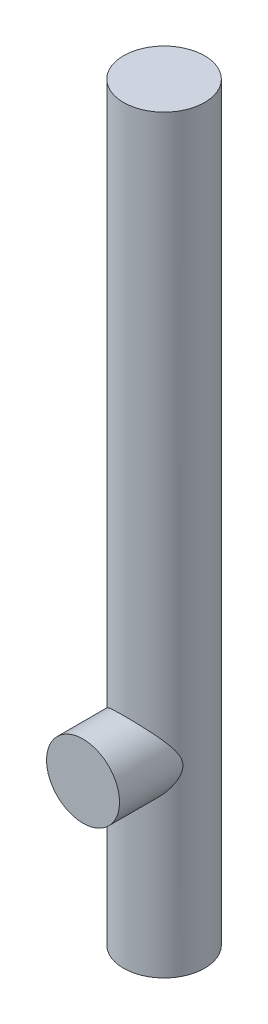
ISO-10303-21;
HEADER;
FILE_DESCRIPTION(('STEP AP214'),'2;1');
FILE_NAME('part.step','',(''),(''),'','','');
FILE_SCHEMA(('AUTOMOTIVE_DESIGN { 1 0 10303 214 1 1 1 1 }'));
ENDSEC;
DATA;
#1=APPLICATION_CONTEXT('core data for automotive mechanical design processes');
#2=APPLICATION_PROTOCOL_DEFINITION('international standard','automotive_design',2000,#1);
#3=PRODUCT_CONTEXT('',#1,'mechanical');
#4=PRODUCT('Part','Part','',(#3));
#5=PRODUCT_RELATED_PRODUCT_CATEGORY('part','',(#4));
#6=PRODUCT_DEFINITION_FORMATION('','',#4);
#7=PRODUCT_DEFINITION_CONTEXT('part definition',#1,'design');
#8=PRODUCT_DEFINITION('design','',#6,#7);
#9=PRODUCT_DEFINITION_SHAPE('','',#8);
#10=(LENGTH_UNIT() NAMED_UNIT(*) SI_UNIT(.MILLI.,.METRE.));
#11=(NAMED_UNIT(*) PLANE_ANGLE_UNIT() SI_UNIT($,.RADIAN.));
#12=(NAMED_UNIT(*) SI_UNIT($,.STERADIAN.) SOLID_ANGLE_UNIT());
#13=UNCERTAINTY_MEASURE_WITH_UNIT(LENGTH_MEASURE(1.E-05),#10,'distance_accuracy_value','');
#14=(GEOMETRIC_REPRESENTATION_CONTEXT(3) GLOBAL_UNCERTAINTY_ASSIGNED_CONTEXT((#13)) GLOBAL_UNIT_ASSIGNED_CONTEXT((#10,
#11,#12)) REPRESENTATION_CONTEXT('',''));
#15=CARTESIAN_POINT('',(0.,0.,0.));
#16=DIRECTION('',(0.,0.,1.));
#17=DIRECTION('',(1.,0.,0.));
#18=AXIS2_PLACEMENT_3D('',#15,#16,#17);
#19=CARTESIAN_POINT('',(0.,185.,0.));
#20=DIRECTION('',(0.,-1.,0.));
#21=DIRECTION('',(0.,0.,-1.));
#22=AXIS2_PLACEMENT_3D('',#19,#20,#21);
#23=CYLINDRICAL_SURFACE('',#22,10.);
#24=CARTESIAN_POINT('',(9.,45.,4.35889894354067));
#25=CARTESIAN_POINT('',(8.99999912535712,44.8651133026897,4.35890205264934));
#26=CARTESIAN_POINT('',(8.99695748215696,44.7302113768304,4.36519808969853));
#27=CARTESIAN_POINT('',(8.98489654986775,44.4617505091759,4.38996756039788));
#28=CARTESIAN_POINT('',(8.97587367515399,44.3281924217691,4.4084482984887));
#29=CARTESIAN_POINT('',(8.95210526166123,44.063214575469,4.45651482600749));
#30=CARTESIAN_POINT('',(8.93734222004527,43.9318026500913,4.48613457119213));
#31=CARTESIAN_POINT('',(8.9024789946339,43.6722050616975,4.55492615415433));
#32=CARTESIAN_POINT('',(8.88237608628868,43.5440210823264,4.59410286732982));
#33=CARTESIAN_POINT('',(8.82637538777225,43.2304654725246,4.70109229114711));
#34=CARTESIAN_POINT('',(8.7875306506708,43.0472314485827,4.77361658229959));
#35=CARTESIAN_POINT('',(8.70010079639884,42.688645377293,4.93116298372346));
#36=CARTESIAN_POINT('',(8.65150904982453,42.5132987944844,5.01619358957547));
#37=CARTESIAN_POINT('',(8.54518966324808,42.1694130177951,5.19524869247314));
#38=CARTESIAN_POINT('',(8.48743300976231,42.0008976515054,5.28930136368018));
#39=CARTESIAN_POINT('',(8.36339921902532,41.6706386168216,5.48332381283702));
#40=CARTESIAN_POINT('',(8.29712321762531,41.5088940495075,5.58329280103048));
#41=CARTESIAN_POINT('',(8.10625726460239,41.0786539895791,5.85946693578963));
#42=CARTESIAN_POINT('',(7.9737075270327,40.8160153646168,6.03934411413995));
#43=CARTESIAN_POINT('',(7.68493006383419,40.3066500844855,6.40280477622872));
#44=CARTESIAN_POINT('',(7.52868743211335,40.0599335868181,6.58639052969803));
#45=CARTESIAN_POINT('',(7.19261819997356,39.5823079366317,6.95182059767509));
#46=CARTESIAN_POINT('',(7.01281933090629,39.3513806754376,7.13366669420351));
#47=CARTESIAN_POINT('',(6.62916573859886,38.9056962037749,7.49152538561092));
#48=CARTESIAN_POINT('',(6.42532305005534,38.6909309911236,7.66754084287518));
#49=CARTESIAN_POINT('',(6.04558378793642,38.3290173939466,7.96834546995208));
#50=CARTESIAN_POINT('',(5.87490177551246,38.1781036661065,8.09520414957317));
#51=CARTESIAN_POINT('',(5.51940577487176,37.887415523505,8.34163725796752));
#52=CARTESIAN_POINT('',(5.33459532725733,37.7476383357283,8.46121349832105));
#53=CARTESIAN_POINT('',(4.95112549934782,37.4806336958983,8.69116088975333));
#54=CARTESIAN_POINT('',(4.75248411397547,37.3533904385687,8.80154360599195));
#55=CARTESIAN_POINT('',(4.34147821301175,37.1127803744773,9.01136882316648));
#56=CARTESIAN_POINT('',(4.12911666092557,36.9994105863069,9.11081367418325));
#57=CARTESIAN_POINT('',(3.73425659482902,36.8089365816634,9.27857249043856));
#58=CARTESIAN_POINT('',(3.55405280645836,36.7290779677362,9.34916933365047));
#59=CARTESIAN_POINT('',(3.18584237940011,36.5803913968552,9.48096111974591));
#60=CARTESIAN_POINT('',(2.99783751140253,36.5115609537826,9.5421581815258));
#61=CARTESIAN_POINT('',(2.61489582734803,36.3858888127018,9.65412334579318));
#62=CARTESIAN_POINT('',(2.41996130272349,36.3290431939767,9.70489485875411));
#63=CARTESIAN_POINT('',(2.02420401814152,36.2282106173982,9.7950896181834));
#64=CARTESIAN_POINT('',(1.82338119421535,36.184223799296,9.83451274131586));
#65=CARTESIAN_POINT('',(1.41598347641716,36.1096609282866,9.90140674639182));
#66=CARTESIAN_POINT('',(1.20938094567453,36.079168410175,9.92880317038021));
#67=CARTESIAN_POINT('',(0.793250860746745,36.0325822107511,9.97068088946279));
#68=CARTESIAN_POINT('',(0.583723299339995,36.0164885649945,9.98516215266501));
#69=CARTESIAN_POINT('',(0.163611568829693,35.9990322764588,10.0008702351371));
#70=CARTESIAN_POINT('',(-0.0469723139347515,35.9976658368406,10.0021004706707));
#71=CARTESIAN_POINT('',(-0.467365503289416,36.0096840912363,9.99128485074787));
#72=CARTESIAN_POINT('',(-0.677174861614039,36.0230677814485,9.97923989871779));
#73=CARTESIAN_POINT('',(-1.07384381441597,36.062291636239,9.94397134065504));
#74=CARTESIAN_POINT('',(-1.26094650315761,36.0867900595726,9.92195216135952));
#75=CARTESIAN_POINT('',(-1.63186604471116,36.1471851862628,9.86773291863874));
#76=CARTESIAN_POINT('',(-1.81568179179051,36.1830856518268,9.83552949484463));
#77=CARTESIAN_POINT('',(-2.17882097661351,36.2657335435971,9.76150976208725));
#78=CARTESIAN_POINT('',(-2.35814551157423,36.3124782912992,9.71969582691419));
#79=CARTESIAN_POINT('',(-2.71150026693551,36.4161960012943,9.6271047274864));
#80=CARTESIAN_POINT('',(-2.88552846129418,36.4731728216123,9.57632418247355));
#81=CARTESIAN_POINT('',(-3.23684891234679,36.6000261465225,9.46354426692276));
#82=CARTESIAN_POINT('',(-3.4137998835425,36.6704374124868,9.40108348227431));
#83=CARTESIAN_POINT('',(-3.76032311185089,36.8210205780723,9.26792718466868));
#84=CARTESIAN_POINT('',(-3.92989246774166,36.9011962692526,9.19722847336055));
#85=CARTESIAN_POINT('',(-4.42674860862046,37.155122277499,8.97415817693535));
#86=CARTESIAN_POINT('',(-4.74238355021897,37.3423451534514,8.81074657926129));
#87=CARTESIAN_POINT('',(-5.26930360195842,37.6986007956944,8.50319879190109));
#88=CARTESIAN_POINT('',(-5.48760989608512,37.8614584382963,8.36364830659535));
#89=CARTESIAN_POINT('',(-5.90479490584758,38.202505079992,8.07451195589537));
#90=CARTESIAN_POINT('',(-6.10367157843543,38.3806956876681,7.92492503794179));
#91=CARTESIAN_POINT('',(-6.4827911309694,38.7514778533139,7.61794977625357));
#92=CARTESIAN_POINT('',(-6.66296060423031,38.9441213846346,7.46053403765854));
#93=CARTESIAN_POINT('',(-7.00409169077636,39.3421396064073,7.14123577234887));
#94=CARTESIAN_POINT('',(-7.16505757982203,39.5475114473145,6.97935424988046));
#95=CARTESIAN_POINT('',(-7.47178079581673,39.9757045361432,6.65013547637274));
#96=CARTESIAN_POINT('',(-7.61707631521067,40.1988276198533,6.48276094854365));
#97=CARTESIAN_POINT('',(-7.88809939990222,40.6584416008039,6.1501138640943));
#98=CARTESIAN_POINT('',(-8.01381436213684,40.894940975338,5.98484272364441));
#99=CARTESIAN_POINT('',(-8.24488753235155,41.381419124842,5.66224333386347));
#100=CARTESIAN_POINT('',(-8.35032106625077,41.6313434318371,5.50488736197904));
#101=CARTESIAN_POINT('',(-8.54035974315346,42.147330183529,5.20515008912266));
#102=CARTESIAN_POINT('',(-8.62499660192536,42.4133672733964,5.06274617801728));
#103=CARTESIAN_POINT('',(-8.76002630276784,42.921556799806,4.82469511280736));
#104=CARTESIAN_POINT('',(-8.81369606865005,43.1610014233546,4.7252211106063));
#105=CARTESIAN_POINT('',(-8.90219524060406,43.6535319311485,4.55633017490001));
#106=CARTESIAN_POINT('',(-8.93707809716659,43.9065768379197,4.48682808219568));
#107=CARTESIAN_POINT('',(-8.97335953687145,44.2955645458327,4.41356439995177));
#108=CARTESIAN_POINT('',(-8.9827886925873,44.42789922365,4.39428182413943));
#109=CARTESIAN_POINT('',(-8.99578373472875,44.6940725951772,4.36762056816597));
#110=CARTESIAN_POINT('',(-8.99935047377493,44.8279110673264,4.36024015697589));
#111=CARTESIAN_POINT('',(-9.0004874385103,45.0957009117447,4.3578923914484));
#112=CARTESIAN_POINT('',(-8.9980585338018,45.2296522648246,4.36292323699441));
#113=CARTESIAN_POINT('',(-8.98729586683956,45.4963140470578,4.38504950778809));
#114=CARTESIAN_POINT('',(-8.97896117704866,45.629024277968,4.40214682814263));
#115=CARTESIAN_POINT('',(-8.95569450928305,45.9033775794599,4.4493010325177));
#116=CARTESIAN_POINT('',(-8.94025607511049,46.0448053746696,4.48034740897714));
#117=CARTESIAN_POINT('',(-8.90319731957677,46.323985665339,4.55354272598014));
#118=CARTESIAN_POINT('',(-8.88157218906138,46.4617352101237,4.59570030166617));
#119=CARTESIAN_POINT('',(-8.83255668828444,46.7335172667204,4.68921424244549));
#120=CARTESIAN_POINT('',(-8.80514690558526,46.867535498013,4.74060149222419));
#121=CARTESIAN_POINT('',(-8.74504928457351,47.1312910412725,4.85057224715783));
#122=CARTESIAN_POINT('',(-8.71236242215837,47.2610291394377,4.90915442126743));
#123=CARTESIAN_POINT('',(-8.61252234498928,47.6237231156824,5.08343310391401));
#124=CARTESIAN_POINT('',(-8.53947592383408,47.8518685869357,5.20578081924683));
#125=CARTESIAN_POINT('',(-8.37804816545499,48.2960886935703,5.46180460769207));
#126=CARTESIAN_POINT('',(-8.28965371938902,48.5121527999134,5.59549031431133));
#127=CARTESIAN_POINT('',(-8.09807594943103,48.9338069318813,5.86933922636943));
#128=CARTESIAN_POINT('',(-7.99487155972158,49.1393814625812,6.00951146254713));
#129=CARTESIAN_POINT('',(-7.77405349557075,49.5405380425669,6.29256163905301));
#130=CARTESIAN_POINT('',(-7.65644427483957,49.7361231540299,6.43543873159648));
#131=CARTESIAN_POINT('',(-7.39311359593735,50.138664448097,6.73692776982221));
#132=CARTESIAN_POINT('',(-7.24572426595572,50.3445240235141,6.89555121792686));
#133=CARTESIAN_POINT('',(-6.93292570338505,50.7444743554134,7.20997553828666));
#134=CARTESIAN_POINT('',(-6.76751309438644,50.9385628961191,7.36577587527348));
#135=CARTESIAN_POINT('',(-6.41870489467024,51.3139329869542,7.67163265392071));
#136=CARTESIAN_POINT('',(-6.23534103680142,51.4952361954838,7.8216986019033));
#137=CARTESIAN_POINT('',(-5.85009281613774,51.8442648664726,8.11386817771413));
#138=CARTESIAN_POINT('',(-5.64820551412546,52.0119881661567,8.25597053613325));
#139=CARTESIAN_POINT('',(-5.26922126522198,52.2992921985611,8.50148892808147));
#140=CARTESIAN_POINT('',(-5.09552698294098,52.4216934529712,8.60686368048649));
#141=CARTESIAN_POINT('',(-4.73657842258545,52.6557633386122,8.8094994100747));
#142=CARTESIAN_POINT('',(-4.5513268168504,52.767434435863,8.90676225086735));
#143=CARTESIAN_POINT('',(-4.16970074078569,52.9787929982939,9.0916731912279));
#144=CARTESIAN_POINT('',(-3.97333420416379,53.0784888564452,9.17932802085757));
#145=CARTESIAN_POINT('',(-3.56998113695938,53.2646563020772,9.34358734558862));
#146=CARTESIAN_POINT('',(-3.36299628171727,53.3511299672151,9.42019357669398));
#147=CARTESIAN_POINT('',(-2.97233556603463,53.497157880961,9.54990844335347));
#148=CARTESIAN_POINT('',(-2.79003935365329,53.558807143493,9.60481860313305));
#149=CARTESIAN_POINT('',(-2.41940821345685,53.6708665635573,9.70480739147791));
#150=CARTESIAN_POINT('',(-2.2310744213577,53.7212788208328,9.74988785678238));
#151=CARTESIAN_POINT('',(-1.84946748186767,53.8100981302125,9.82941697781403));
#152=CARTESIAN_POINT('',(-1.65619641539529,53.8485101526257,9.86387003517195));
#153=CARTESIAN_POINT('',(-1.26589907617537,53.9127217285845,9.92151239575735));
#154=CARTESIAN_POINT('',(-1.0688727652908,53.9385211539698,9.94470158452926));
#155=CARTESIAN_POINT('',(-0.671790359912244,53.9771170537292,9.97940673646162));
#156=CARTESIAN_POINT('',(-0.471725829851823,53.9898657092011,9.99087977046663));
#157=CARTESIAN_POINT('',(-0.070861660979596,54.0019546215712,10.0017588451537));
#158=CARTESIAN_POINT('',(0.129937978869543,54.0012948595412,10.0011648688012));
#159=CARTESIAN_POINT('',(0.530651634674792,53.986579427486,9.98792268833583));
#160=CARTESIAN_POINT('',(0.730565610643982,53.97252315869,9.97527394542274));
#161=CARTESIAN_POINT('',(1.12791971023249,53.9312762233439,9.93818964864157));
#162=CARTESIAN_POINT('',(1.32535987797636,53.9040857914068,9.91375430531542));
#163=CARTESIAN_POINT('',(1.70526039344401,53.8389541173966,9.85529889419251));
#164=CARTESIAN_POINT('',(1.88793664748295,53.8017074248042,9.82189866182961));
#165=CARTESIAN_POINT('',(2.24881401493975,53.7164915112648,9.74560741236711));
#166=CARTESIAN_POINT('',(2.42701339985728,53.6685182175002,9.70271279037479));
#167=CARTESIAN_POINT('',(2.77796143478116,53.562507201065,9.6081193245495));
#168=CARTESIAN_POINT('',(2.95071069291595,53.5044706059915,9.55642146713435));
#169=CARTESIAN_POINT('',(3.29010363483708,53.3790194518239,9.44495312874036));
#170=CARTESIAN_POINT('',(3.45674611181779,53.3116030516098,9.38518106297841));
#171=CARTESIAN_POINT('',(3.84227434356776,53.1422240210001,9.235460066627));
#172=CARTESIAN_POINT('',(4.05834115416313,53.0365680465041,9.14239956003431));
#173=CARTESIAN_POINT('',(4.47729042012556,52.8109236683685,8.94469511137592));
#174=CARTESIAN_POINT('',(4.68016893835009,52.6909310148197,8.84004773522101));
#175=CARTESIAN_POINT('',(5.07264542900837,52.4379358342781,8.62084033218495));
#176=CARTESIAN_POINT('',(5.26221577554223,52.3049075423903,8.50626072802113));
#177=CARTESIAN_POINT('',(5.62744707893479,52.0274070967707,8.26917497172541));
#178=CARTESIAN_POINT('',(5.80310799129662,51.8829349064323,8.14666879423836));
#179=CARTESIAN_POINT('',(6.1920745014548,51.5379570994992,7.85707158567732));
#180=CARTESIAN_POINT('',(6.40051630371966,51.3338029229894,7.68778029273014));
#181=CARTESIAN_POINT('',(6.79418604927295,50.9095556792908,7.34218410606766));
#182=CARTESIAN_POINT('',(6.97940341119233,50.6894554183869,7.16587606327237));
#183=CARTESIAN_POINT('',(7.32689040909652,50.2343697873848,6.81017334790342));
#184=CARTESIAN_POINT('',(7.48916801761666,49.9993896299945,6.63077977211647));
#185=CARTESIAN_POINT('',(7.79105688522358,49.5145331609667,6.27327877761557));
#186=CARTESIAN_POINT('',(7.93068022445731,49.2646648860948,6.09517072214975));
#187=CARTESIAN_POINT('',(8.12831343012932,48.8671408409498,5.82617542866974));
#188=CARTESIAN_POINT('',(8.19438577655316,48.725163173927,5.7327485165047));
#189=CARTESIAN_POINT('',(8.3197272339664,48.4361266173235,5.54927574750491));
#190=CARTESIAN_POINT('',(8.37899757001453,48.2890686489441,5.45922928381502));
#191=CARTESIAN_POINT('',(8.490496923396,47.9894786000647,5.28414800399164));
#192=CARTESIAN_POINT('',(8.54272981440166,47.8369495900624,5.19911044539866));
#193=CARTESIAN_POINT('',(8.63980427677106,47.5259341677122,5.03614833111317));
#194=CARTESIAN_POINT('',(8.68464770398865,47.367449263496,4.95822199164807));
#195=CARTESIAN_POINT('',(8.78660275340403,46.9640757384819,4.77610131122456));
#196=CARTESIAN_POINT('',(8.83888352112529,46.715065805748,4.67786499097416));
#197=CARTESIAN_POINT('',(8.90192349638275,46.3313544377884,4.55608219185004));
#198=CARTESIAN_POINT('',(8.9203598693561,46.2019186610926,4.51977922304436));
#199=CARTESIAN_POINT('',(8.95174626517207,45.9400015879003,4.45729281315702));
#200=CARTESIAN_POINT('',(8.96469998156118,45.8075224053138,4.43110256040511));
#201=CARTESIAN_POINT('',(8.98308714188627,45.5626731750046,4.3936892938895));
#202=CARTESIAN_POINT('',(8.98941528473155,45.4506402155054,4.38069701614408));
#203=CARTESIAN_POINT('',(8.99787210005149,45.2257417307372,4.36330049856424));
#204=CARTESIAN_POINT('',(9.00000073192067,45.1128761974286,4.35889634176918));
#205=CARTESIAN_POINT('',(9.,45.,4.35889894354067));
#206=B_SPLINE_CURVE_WITH_KNOTS('',3,(#24,#25,#26,#27,#28,#29,#30,#31,#32,#33,#34,#35,#36,#37,
#38,#39,#40,#41,#42,#43,#44,#45,#46,#47,#48,#49,#50,#51,#52,#53,#54,#55,#56,#57,#58,#59,#60,#61,
#62,#63,#64,#65,#66,#67,#68,#69,#70,#71,#72,#73,#74,#75,#76,#77,#78,#79,#80,#81,#82,#83,#84,#85,
#86,#87,#88,#89,#90,#91,#92,#93,#94,#95,#96,#97,#98,#99,#100,#101,#102,#103,#104,#105,#106,#107,
#108,#109,#110,#111,#112,#113,#114,#115,#116,#117,#118,#119,#120,#121,#122,#123,#124,#125,#126,
#127,#128,#129,#130,#131,#132,#133,#134,#135,#136,#137,#138,#139,#140,#141,#142,#143,#144,#145,
#146,#147,#148,#149,#150,#151,#152,#153,#154,#155,#156,#157,#158,#159,#160,#161,#162,#163,#164,
#165,#166,#167,#168,#169,#170,#171,#172,#173,#174,#175,#176,#177,#178,#179,#180,#181,#182,#183,
#184,#185,#186,#187,#188,#189,#190,#191,#192,#193,#194,#195,#196,#197,#198,#199,#200,#201,#202,
#203,#204,#205),.UNSPECIFIED.,.T.,.F.,(4,2,2,2,2,2,2,2,2,2,2,2,2,2,2,2,2,2,2,2,2,2,2,2,2,2,2,2,
2,2,2,2,2,2,2,2,2,2,2,2,2,2,2,2,2,2,2,2,2,2,2,2,2,2,2,2,2,2,2,2,2,2,2,2,2,2,2,2,2,2,2,2,2,2,2,2,
2,2,2,2,2,2,2,2,2,2,2,2,2,2,4),(0.,0.404512180865151,0.809267077988753,1.21526595091239,
1.62147237509055,2.22299091930448,2.8249199805846,3.42879405743724,4.0325877054769,
5.06563699313576,6.09933892834503,7.13183470280784,8.16381585596713,8.94547945494068,
9.7269478062121,10.5074177607579,11.2877196966589,11.9152316655241,12.5426019725436,
13.1697667220006,13.7969382873154,14.427939753067,15.0589427769736,15.6897831173204,
16.3205805292636,16.8898749302337,17.4593573705495,18.0286992999411,18.5982563533851,
19.1989364458937,19.7998505326657,21.0010152937993,21.9180143412781,22.8351097087546,
23.755677585834,24.6760401104657,25.6186550880061,26.5618742963122,27.5015196953184,
28.4397230771271,29.2322108071569,30.0224317631998,30.4240480430087,30.8256059072138,
31.2271055332814,31.6286682311313,32.0648223195064,32.5013163725605,32.9392992144881,
33.3772011522475,34.1828267261203,34.9891438052566,35.7966193807316,36.6038459267802,
37.4993771313845,38.3950763906349,39.2892199490582,40.1835056323695,40.8944569895325,
41.6052445620685,42.3155310285198,43.0257057697957,43.6254612901328,44.2251046462227,
44.8244993091539,45.423900062588,46.0254892839223,46.6270793545023,47.2286963150383,
47.8303025293971,48.3979036291108,48.9657206101842,49.5334740081948,50.1013390056186,
50.8738837704294,51.6466581162456,52.4209918972016,53.1953281551835,54.2058878541141,
55.2169063175209,56.2275725407757,57.2376980532021,57.7845643212449,58.3313319422497,
58.8777973615602,59.4241253269507,60.2394493672194,60.6461003165963,61.0524768763387,
61.3909784203573,61.7294832373638),.UNSPECIFIED.);
#207=CARTESIAN_POINT('',(9.,45.,4.35889894354067));
#208=VERTEX_POINT('',#207);
#209=EDGE_CURVE('E54',#208,#208,#206,.T.);
#210=ORIENTED_EDGE('',*,*,#209,.T.);
#211=EDGE_LOOP('',(#210));
#212=FACE_BOUND('',#211,.T.);
#213=CARTESIAN_POINT('',(0.,185.,0.));
#214=DIRECTION('',(0.,1.,0.));
#215=DIRECTION('',(0.,0.,1.));
#216=AXIS2_PLACEMENT_3D('',#213,#214,#215);
#217=CIRCLE('',#216,10.);
#218=CARTESIAN_POINT('',(0.,185.,10.));
#219=VERTEX_POINT('',#218);
#220=EDGE_CURVE('E11',#219,#219,#217,.T.);
#221=ORIENTED_EDGE('',*,*,#220,.F.);
#222=EDGE_LOOP('',(#221));
#223=FACE_BOUND('',#222,.T.);
#224=CARTESIAN_POINT('',(0.,0.,0.));
#225=DIRECTION('',(0.,1.,0.));
#226=DIRECTION('',(0.,0.,1.));
#227=AXIS2_PLACEMENT_3D('',#224,#225,#226);
#228=CIRCLE('',#227,10.);
#229=CARTESIAN_POINT('',(0.,0.,10.));
#230=VERTEX_POINT('',#229);
#231=EDGE_CURVE('E63',#230,#230,#228,.T.);
#232=ORIENTED_EDGE('',*,*,#231,.T.);
#233=EDGE_LOOP('',(#232));
#234=FACE_BOUND('',#233,.T.);
#235=ADVANCED_FACE('F50',(#212,#223,#234),#23,.T.);
#236=CARTESIAN_POINT('',(0.,185.,0.));
#237=DIRECTION('',(0.,1.,0.));
#238=DIRECTION('',(0.,0.,1.));
#239=AXIS2_PLACEMENT_3D('',#236,#237,#238);
#240=PLANE('',#239);
#241=ORIENTED_EDGE('',*,*,#220,.T.);
#242=EDGE_LOOP('',(#241));
#243=FACE_BOUND('',#242,.T.);
#244=ADVANCED_FACE('F91',(#243),#240,.T.);
#245=CARTESIAN_POINT('',(0.,0.,0.));
#246=DIRECTION('',(0.,1.,0.));
#247=DIRECTION('',(0.,0.,1.));
#248=AXIS2_PLACEMENT_3D('',#245,#246,#247);
#249=PLANE('',#248);
#250=ORIENTED_EDGE('',*,*,#231,.F.);
#251=EDGE_LOOP('',(#250));
#252=FACE_BOUND('',#251,.T.);
#253=ADVANCED_FACE('F84',(#252),#249,.F.);
#254=CARTESIAN_POINT('',(0.,45.,0.));
#255=DIRECTION('',(0.,0.,1.));
#256=DIRECTION('',(1.,0.,0.));
#257=AXIS2_PLACEMENT_3D('',#254,#255,#256);
#258=CYLINDRICAL_SURFACE('',#257,9.);
#259=CARTESIAN_POINT('',(0.,45.,19.9999999999999));
#260=DIRECTION('',(0.,0.,1.));
#261=DIRECTION('',(1.,0.,0.));
#262=AXIS2_PLACEMENT_3D('',#259,#260,#261);
#263=CIRCLE('',#262,9.);
#264=CARTESIAN_POINT('',(9.,45.,19.9999999999999));
#265=VERTEX_POINT('',#264);
#266=EDGE_CURVE('E70',#265,#265,#263,.T.);
#267=ORIENTED_EDGE('',*,*,#266,.F.);
#268=EDGE_LOOP('',(#267));
#269=FACE_BOUND('',#268,.T.);
#270=ORIENTED_EDGE('',*,*,#209,.F.);
#271=EDGE_LOOP('',(#270));
#272=FACE_BOUND('',#271,.T.);
#273=ADVANCED_FACE('F81',(#269,#272),#258,.T.);
#274=CARTESIAN_POINT('',(0.,0.,19.9999999999999));
#275=DIRECTION('',(0.,0.,1.));
#276=DIRECTION('',(1.,0.,0.));
#277=AXIS2_PLACEMENT_3D('',#274,#275,#276);
#278=PLANE('',#277);
#279=ORIENTED_EDGE('',*,*,#266,.T.);
#280=EDGE_LOOP('',(#279));
#281=FACE_BOUND('',#280,.T.);
#282=ADVANCED_FACE('F83',(#281),#278,.T.);
#283=CLOSED_SHELL('',(#235,#244,#253,#273,#282));
#284=MANIFOLD_SOLID_BREP('B2',#283);
#285=ADVANCED_BREP_SHAPE_REPRESENTATION('',(#18,#284),#14);
#286=SHAPE_DEFINITION_REPRESENTATION(#9,#285);
ENDSEC;
END-ISO-10303-21;
